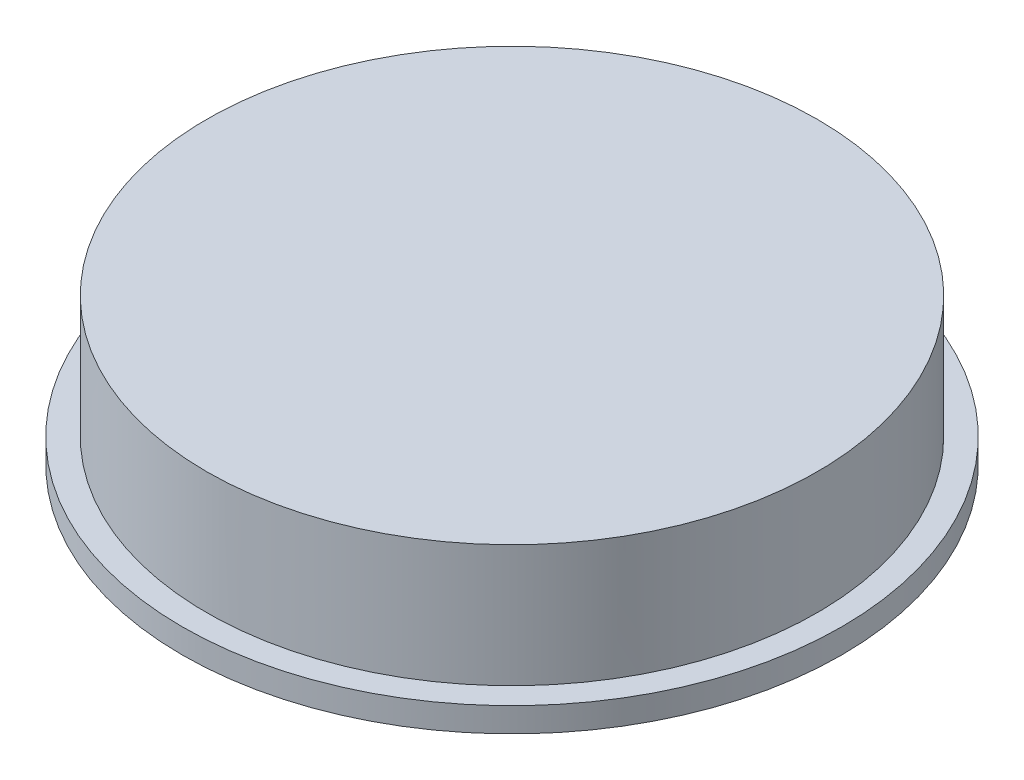
ISO-10303-21;
HEADER;
FILE_DESCRIPTION(('STEP AP214'),'2;1');
FILE_NAME('part.step','',(''),(''),'','','');
FILE_SCHEMA(('AUTOMOTIVE_DESIGN { 1 0 10303 214 1 1 1 1 }'));
ENDSEC;
DATA;
#1=APPLICATION_CONTEXT('core data for automotive mechanical design processes');
#2=APPLICATION_PROTOCOL_DEFINITION('international standard','automotive_design',2000,#1);
#3=PRODUCT_CONTEXT('',#1,'mechanical');
#4=PRODUCT('Part','Part','',(#3));
#5=PRODUCT_RELATED_PRODUCT_CATEGORY('part','',(#4));
#6=PRODUCT_DEFINITION_FORMATION('','',#4);
#7=PRODUCT_DEFINITION_CONTEXT('part definition',#1,'design');
#8=PRODUCT_DEFINITION('design','',#6,#7);
#9=PRODUCT_DEFINITION_SHAPE('','',#8);
#10=(LENGTH_UNIT() NAMED_UNIT(*) SI_UNIT(.MILLI.,.METRE.));
#11=(NAMED_UNIT(*) PLANE_ANGLE_UNIT() SI_UNIT($,.RADIAN.));
#12=(NAMED_UNIT(*) SI_UNIT($,.STERADIAN.) SOLID_ANGLE_UNIT());
#13=UNCERTAINTY_MEASURE_WITH_UNIT(LENGTH_MEASURE(1.E-05),#10,'distance_accuracy_value','');
#14=(GEOMETRIC_REPRESENTATION_CONTEXT(3) GLOBAL_UNCERTAINTY_ASSIGNED_CONTEXT((#13)) GLOBAL_UNIT_ASSIGNED_CONTEXT((#10,
#11,#12)) REPRESENTATION_CONTEXT('',''));
#15=CARTESIAN_POINT('',(0.,0.,0.));
#16=DIRECTION('',(0.,0.,1.));
#17=DIRECTION('',(1.,0.,0.));
#18=AXIS2_PLACEMENT_3D('',#15,#16,#17);
#19=CARTESIAN_POINT('',(0.,0.,0.));
#20=DIRECTION('',(0.,1.,0.));
#21=DIRECTION('',(0.,0.,1.));
#22=AXIS2_PLACEMENT_3D('',#19,#20,#21);
#23=PLANE('',#22);
#24=DIRECTION('',(-1.,0.,0.));
#25=VECTOR('',#24,1.);
#26=CARTESIAN_POINT('',(-3.8925,0.,-3.8925));
#27=LINE('',#26,#25);
#28=CARTESIAN_POINT('',(2.8925,0.,-3.8925));
#29=VERTEX_POINT('',#28);
#30=CARTESIAN_POINT('',(-2.8925,0.,-3.8925));
#31=VERTEX_POINT('',#30);
#32=EDGE_CURVE('E190',#29,#31,#27,.T.);
#33=ORIENTED_EDGE('',*,*,#32,.F.);
#34=CARTESIAN_POINT('',(2.8925,0.,-2.8925));
#35=DIRECTION('',(0.,1.,0.));
#36=DIRECTION('',(0.,0.,1.));
#37=AXIS2_PLACEMENT_3D('',#34,#35,#36);
#38=CIRCLE('',#37,1.);
#39=CARTESIAN_POINT('',(3.8925,0.,-2.8925));
#40=VERTEX_POINT('',#39);
#41=EDGE_CURVE('E219',#29,#40,#38,.F.);
#42=ORIENTED_EDGE('',*,*,#41,.T.);
#43=DIRECTION('',(0.,0.,-1.));
#44=VECTOR('',#43,1.);
#45=CARTESIAN_POINT('',(3.8925,0.,-3.8925));
#46=LINE('',#45,#44);
#47=CARTESIAN_POINT('',(3.8925,0.,2.8925));
#48=VERTEX_POINT('',#47);
#49=EDGE_CURVE('E165',#48,#40,#46,.T.);
#50=ORIENTED_EDGE('',*,*,#49,.F.);
#51=CARTESIAN_POINT('',(2.8925,0.,2.8925));
#52=DIRECTION('',(0.,1.,0.));
#53=DIRECTION('',(0.,0.,1.));
#54=AXIS2_PLACEMENT_3D('',#51,#52,#53);
#55=CIRCLE('',#54,1.);
#56=CARTESIAN_POINT('',(2.8925,0.,3.8925));
#57=VERTEX_POINT('',#56);
#58=EDGE_CURVE('E210',#48,#57,#55,.F.);
#59=ORIENTED_EDGE('',*,*,#58,.T.);
#60=DIRECTION('',(1.,0.,0.));
#61=VECTOR('',#60,1.);
#62=CARTESIAN_POINT('',(-3.8925,0.,3.8925));
#63=LINE('',#62,#61);
#64=CARTESIAN_POINT('',(-2.8925,0.,3.8925));
#65=VERTEX_POINT('',#64);
#66=EDGE_CURVE('E176',#65,#57,#63,.T.);
#67=ORIENTED_EDGE('',*,*,#66,.F.);
#68=CARTESIAN_POINT('',(-2.8925,0.,2.8925));
#69=DIRECTION('',(0.,1.,0.));
#70=DIRECTION('',(0.,0.,1.));
#71=AXIS2_PLACEMENT_3D('',#68,#69,#70);
#72=CIRCLE('',#71,1.);
#73=CARTESIAN_POINT('',(-3.8925,0.,2.8925));
#74=VERTEX_POINT('',#73);
#75=EDGE_CURVE('E213',#65,#74,#72,.F.);
#76=ORIENTED_EDGE('',*,*,#75,.T.);
#77=DIRECTION('',(0.,0.,1.));
#78=VECTOR('',#77,1.);
#79=CARTESIAN_POINT('',(-3.8925,0.,-3.8925));
#80=LINE('',#79,#78);
#81=CARTESIAN_POINT('',(-3.8925,0.,-2.8925));
#82=VERTEX_POINT('',#81);
#83=EDGE_CURVE('E194',#82,#74,#80,.T.);
#84=ORIENTED_EDGE('',*,*,#83,.F.);
#85=CARTESIAN_POINT('',(-2.8925,0.,-2.8925));
#86=DIRECTION('',(0.,1.,0.));
#87=DIRECTION('',(0.,0.,1.));
#88=AXIS2_PLACEMENT_3D('',#85,#86,#87);
#89=CIRCLE('',#88,1.);
#90=EDGE_CURVE('E216',#82,#31,#89,.F.);
#91=ORIENTED_EDGE('',*,*,#90,.T.);
#92=EDGE_LOOP('',(#33,#42,#50,#59,#67,#76,#84,#91));
#93=FACE_BOUND('',#92,.T.);
#94=DIRECTION('',(0.,0.,-1.));
#95=VECTOR('',#94,1.);
#96=CARTESIAN_POINT('',(1.8925,0.,-1.8925));
#97=LINE('',#96,#95);
#98=CARTESIAN_POINT('',(1.8925,0.,1.8925));
#99=VERTEX_POINT('',#98);
#100=CARTESIAN_POINT('',(1.8925,0.,-1.8925));
#101=VERTEX_POINT('',#100);
#102=EDGE_CURVE('E339',#99,#101,#97,.T.);
#103=ORIENTED_EDGE('',*,*,#102,.T.);
#104=DIRECTION('',(-1.,0.,0.));
#105=VECTOR('',#104,1.);
#106=CARTESIAN_POINT('',(-1.8925,0.,-1.8925));
#107=LINE('',#106,#105);
#108=CARTESIAN_POINT('',(-1.8925,0.,-1.8925));
#109=VERTEX_POINT('',#108);
#110=EDGE_CURVE('E343',#101,#109,#107,.T.);
#111=ORIENTED_EDGE('',*,*,#110,.T.);
#112=DIRECTION('',(0.,0.,1.));
#113=VECTOR('',#112,1.);
#114=CARTESIAN_POINT('',(-1.8925,0.,-1.8925));
#115=LINE('',#114,#113);
#116=CARTESIAN_POINT('',(-1.8925,0.,1.8925));
#117=VERTEX_POINT('',#116);
#118=EDGE_CURVE('E158',#109,#117,#115,.T.);
#119=ORIENTED_EDGE('',*,*,#118,.T.);
#120=DIRECTION('',(1.,0.,0.));
#121=VECTOR('',#120,1.);
#122=CARTESIAN_POINT('',(-1.8925,0.,1.8925));
#123=LINE('',#122,#121);
#124=EDGE_CURVE('E347',#117,#99,#123,.T.);
#125=ORIENTED_EDGE('',*,*,#124,.T.);
#126=EDGE_LOOP('',(#103,#111,#119,#125));
#127=FACE_BOUND('',#126,.T.);
#128=ADVANCED_FACE('F45',(#93,#127),#23,.F.);
#129=CARTESIAN_POINT('',(3.8925,4.,-3.8925));
#130=DIRECTION('',(-1.,0.,0.));
#131=DIRECTION('',(0.,0.,1.));
#132=AXIS2_PLACEMENT_3D('',#129,#130,#131);
#133=PLANE('',#132);
#134=ORIENTED_EDGE('',*,*,#49,.T.);
#135=DIRECTION('',(0.,-1.,0.));
#136=VECTOR('',#135,1.);
#137=CARTESIAN_POINT('',(3.8925,4.,-2.8925));
#138=LINE('',#137,#136);
#139=CARTESIAN_POINT('',(3.8925,4.,-2.8925));
#140=VERTEX_POINT('',#139);
#141=EDGE_CURVE('E226',#40,#140,#138,.F.);
#142=ORIENTED_EDGE('',*,*,#141,.T.);
#143=DIRECTION('',(0.,0.,-1.));
#144=VECTOR('',#143,1.);
#145=CARTESIAN_POINT('',(3.8925,4.,-3.8925));
#146=LINE('',#145,#144);
#147=CARTESIAN_POINT('',(3.8925,4.,2.8925));
#148=VERTEX_POINT('',#147);
#149=EDGE_CURVE('E171',#148,#140,#146,.T.);
#150=ORIENTED_EDGE('',*,*,#149,.F.);
#151=DIRECTION('',(0.,-1.,0.));
#152=VECTOR('',#151,1.);
#153=CARTESIAN_POINT('',(3.8925,4.,2.8925));
#154=LINE('',#153,#152);
#155=EDGE_CURVE('E222',#148,#48,#154,.T.);
#156=ORIENTED_EDGE('',*,*,#155,.T.);
#157=EDGE_LOOP('',(#134,#142,#150,#156));
#158=FACE_BOUND('',#157,.T.);
#159=ADVANCED_FACE('F273',(#158),#133,.F.);
#160=CARTESIAN_POINT('',(-3.8925,4.,-3.8925));
#161=DIRECTION('',(0.,0.,1.));
#162=DIRECTION('',(1.,0.,0.));
#163=AXIS2_PLACEMENT_3D('',#160,#161,#162);
#164=PLANE('',#163);
#165=DIRECTION('',(-1.,0.,0.));
#166=VECTOR('',#165,1.);
#167=CARTESIAN_POINT('',(-3.8925,4.,-3.8925));
#168=LINE('',#167,#166);
#169=CARTESIAN_POINT('',(2.8925,4.,-3.8925));
#170=VERTEX_POINT('',#169);
#171=CARTESIAN_POINT('',(-2.8925,4.,-3.8925));
#172=VERTEX_POINT('',#171);
#173=EDGE_CURVE('E175',#170,#172,#168,.T.);
#174=ORIENTED_EDGE('',*,*,#173,.F.);
#175=DIRECTION('',(0.,-1.,0.));
#176=VECTOR('',#175,1.);
#177=CARTESIAN_POINT('',(2.8925,4.,-3.8925));
#178=LINE('',#177,#176);
#179=EDGE_CURVE('E206',#170,#29,#178,.T.);
#180=ORIENTED_EDGE('',*,*,#179,.T.);
#181=ORIENTED_EDGE('',*,*,#32,.T.);
#182=DIRECTION('',(0.,-1.,0.));
#183=VECTOR('',#182,1.);
#184=CARTESIAN_POINT('',(-2.8925,4.,-3.8925));
#185=LINE('',#184,#183);
#186=EDGE_CURVE('E203',#31,#172,#185,.F.);
#187=ORIENTED_EDGE('',*,*,#186,.T.);
#188=EDGE_LOOP('',(#174,#180,#181,#187));
#189=FACE_BOUND('',#188,.T.);
#190=ADVANCED_FACE('F265',(#189),#164,.F.);
#191=CARTESIAN_POINT('',(-3.8925,4.,-3.8925));
#192=DIRECTION('',(1.,0.,0.));
#193=DIRECTION('',(0.,0.,-1.));
#194=AXIS2_PLACEMENT_3D('',#191,#192,#193);
#195=PLANE('',#194);
#196=DIRECTION('',(0.,0.,1.));
#197=VECTOR('',#196,1.);
#198=CARTESIAN_POINT('',(-3.8925,4.,-3.8925));
#199=LINE('',#198,#197);
#200=CARTESIAN_POINT('',(-3.8925,4.,-2.8925));
#201=VERTEX_POINT('',#200);
#202=CARTESIAN_POINT('',(-3.8925,4.,2.8925));
#203=VERTEX_POINT('',#202);
#204=EDGE_CURVE('E180',#201,#203,#199,.T.);
#205=ORIENTED_EDGE('',*,*,#204,.F.);
#206=DIRECTION('',(0.,-1.,0.));
#207=VECTOR('',#206,1.);
#208=CARTESIAN_POINT('',(-3.8925,4.,-2.8925));
#209=LINE('',#208,#207);
#210=EDGE_CURVE('E232',#201,#82,#209,.T.);
#211=ORIENTED_EDGE('',*,*,#210,.T.);
#212=ORIENTED_EDGE('',*,*,#83,.T.);
#213=DIRECTION('',(0.,-1.,0.));
#214=VECTOR('',#213,1.);
#215=CARTESIAN_POINT('',(-3.8925,4.,2.8925));
#216=LINE('',#215,#214);
#217=EDGE_CURVE('E229',#74,#203,#216,.F.);
#218=ORIENTED_EDGE('',*,*,#217,.T.);
#219=EDGE_LOOP('',(#205,#211,#212,#218));
#220=FACE_BOUND('',#219,.T.);
#221=ADVANCED_FACE('F257',(#220),#195,.F.);
#222=CARTESIAN_POINT('',(-3.8925,4.,3.8925));
#223=DIRECTION('',(0.,0.,-1.));
#224=DIRECTION('',(-1.,0.,0.));
#225=AXIS2_PLACEMENT_3D('',#222,#223,#224);
#226=PLANE('',#225);
#227=DIRECTION('',(1.,0.,0.));
#228=VECTOR('',#227,1.);
#229=CARTESIAN_POINT('',(-3.8925,4.,3.8925));
#230=LINE('',#229,#228);
#231=CARTESIAN_POINT('',(-2.8925,4.,3.8925));
#232=VERTEX_POINT('',#231);
#233=CARTESIAN_POINT('',(2.8925,4.,3.8925));
#234=VERTEX_POINT('',#233);
#235=EDGE_CURVE('E183',#232,#234,#230,.T.);
#236=ORIENTED_EDGE('',*,*,#235,.F.);
#237=DIRECTION('',(0.,-1.,0.));
#238=VECTOR('',#237,1.);
#239=CARTESIAN_POINT('',(-2.8925,4.,3.8925));
#240=LINE('',#239,#238);
#241=EDGE_CURVE('E238',#232,#65,#240,.T.);
#242=ORIENTED_EDGE('',*,*,#241,.T.);
#243=ORIENTED_EDGE('',*,*,#66,.T.);
#244=DIRECTION('',(0.,-1.,0.));
#245=VECTOR('',#244,1.);
#246=CARTESIAN_POINT('',(2.8925,4.,3.8925));
#247=LINE('',#246,#245);
#248=EDGE_CURVE('E61',#57,#234,#247,.F.);
#249=ORIENTED_EDGE('',*,*,#248,.T.);
#250=EDGE_LOOP('',(#236,#242,#243,#249));
#251=FACE_BOUND('',#250,.T.);
#252=ADVANCED_FACE('F279',(#251),#226,.F.);
#253=CARTESIAN_POINT('',(1.8925,4.,-1.8925));
#254=DIRECTION('',(-1.,0.,0.));
#255=DIRECTION('',(0.,0.,1.));
#256=AXIS2_PLACEMENT_3D('',#253,#254,#255);
#257=PLANE('',#256);
#258=ORIENTED_EDGE('',*,*,#102,.F.);
#259=DIRECTION('',(0.,-1.,0.));
#260=VECTOR('',#259,1.);
#261=CARTESIAN_POINT('',(1.8925,4.,1.8925));
#262=LINE('',#261,#260);
#263=CARTESIAN_POINT('',(1.8925,4.,1.8925));
#264=VERTEX_POINT('',#263);
#265=EDGE_CURVE('E167',#264,#99,#262,.T.);
#266=ORIENTED_EDGE('',*,*,#265,.F.);
#267=DIRECTION('',(0.,0.,-1.));
#268=VECTOR('',#267,1.);
#269=CARTESIAN_POINT('',(1.8925,4.,-1.8925));
#270=LINE('',#269,#268);
#271=CARTESIAN_POINT('',(1.8925,4.,-1.8925));
#272=VERTEX_POINT('',#271);
#273=EDGE_CURVE('E154',#264,#272,#270,.T.);
#274=ORIENTED_EDGE('',*,*,#273,.T.);
#275=DIRECTION('',(0.,-1.,0.));
#276=VECTOR('',#275,1.);
#277=CARTESIAN_POINT('',(1.8925,4.,-1.8925));
#278=LINE('',#277,#276);
#279=EDGE_CURVE('E152',#272,#101,#278,.T.);
#280=ORIENTED_EDGE('',*,*,#279,.T.);
#281=EDGE_LOOP('',(#258,#266,#274,#280));
#282=FACE_BOUND('',#281,.T.);
#283=ADVANCED_FACE('F298',(#282),#257,.T.);
#284=CARTESIAN_POINT('',(-1.8925,4.,-1.8925));
#285=DIRECTION('',(0.,0.,1.));
#286=DIRECTION('',(1.,0.,0.));
#287=AXIS2_PLACEMENT_3D('',#284,#285,#286);
#288=PLANE('',#287);
#289=ORIENTED_EDGE('',*,*,#110,.F.);
#290=ORIENTED_EDGE('',*,*,#279,.F.);
#291=DIRECTION('',(-1.,0.,0.));
#292=VECTOR('',#291,1.);
#293=CARTESIAN_POINT('',(-1.8925,4.,-1.8925));
#294=LINE('',#293,#292);
#295=CARTESIAN_POINT('',(-1.8925,4.,-1.8925));
#296=VERTEX_POINT('',#295);
#297=EDGE_CURVE('E137',#272,#296,#294,.T.);
#298=ORIENTED_EDGE('',*,*,#297,.T.);
#299=DIRECTION('',(0.,-1.,0.));
#300=VECTOR('',#299,1.);
#301=CARTESIAN_POINT('',(-1.8925,4.,-1.8925));
#302=LINE('',#301,#300);
#303=EDGE_CURVE('E149',#296,#109,#302,.T.);
#304=ORIENTED_EDGE('',*,*,#303,.T.);
#305=EDGE_LOOP('',(#289,#290,#298,#304));
#306=FACE_BOUND('',#305,.T.);
#307=ADVANCED_FACE('F148',(#306),#288,.T.);
#308=CARTESIAN_POINT('',(-1.8925,4.,-1.8925));
#309=DIRECTION('',(1.,0.,0.));
#310=DIRECTION('',(0.,0.,-1.));
#311=AXIS2_PLACEMENT_3D('',#308,#309,#310);
#312=PLANE('',#311);
#313=ORIENTED_EDGE('',*,*,#118,.F.);
#314=ORIENTED_EDGE('',*,*,#303,.F.);
#315=DIRECTION('',(0.,0.,1.));
#316=VECTOR('',#315,1.);
#317=CARTESIAN_POINT('',(-1.8925,4.,-1.8925));
#318=LINE('',#317,#316);
#319=CARTESIAN_POINT('',(-1.8925,4.,1.8925));
#320=VERTEX_POINT('',#319);
#321=EDGE_CURVE('E134',#296,#320,#318,.T.);
#322=ORIENTED_EDGE('',*,*,#321,.T.);
#323=DIRECTION('',(0.,-1.,0.));
#324=VECTOR('',#323,1.);
#325=CARTESIAN_POINT('',(-1.8925,4.,1.8925));
#326=LINE('',#325,#324);
#327=EDGE_CURVE('E161',#320,#117,#326,.T.);
#328=ORIENTED_EDGE('',*,*,#327,.T.);
#329=EDGE_LOOP('',(#313,#314,#322,#328));
#330=FACE_BOUND('',#329,.T.);
#331=ADVANCED_FACE('F156',(#330),#312,.T.);
#332=CARTESIAN_POINT('',(-1.8925,4.,1.8925));
#333=DIRECTION('',(0.,0.,-1.));
#334=DIRECTION('',(-1.,0.,0.));
#335=AXIS2_PLACEMENT_3D('',#332,#333,#334);
#336=PLANE('',#335);
#337=ORIENTED_EDGE('',*,*,#124,.F.);
#338=ORIENTED_EDGE('',*,*,#327,.F.);
#339=DIRECTION('',(1.,0.,0.));
#340=VECTOR('',#339,1.);
#341=CARTESIAN_POINT('',(-1.8925,4.,1.8925));
#342=LINE('',#341,#340);
#343=EDGE_CURVE('E140',#320,#264,#342,.T.);
#344=ORIENTED_EDGE('',*,*,#343,.T.);
#345=ORIENTED_EDGE('',*,*,#265,.T.);
#346=EDGE_LOOP('',(#337,#338,#344,#345));
#347=FACE_BOUND('',#346,.T.);
#348=ADVANCED_FACE('F325',(#347),#336,.T.);
#349=CARTESIAN_POINT('',(0.,4.,0.));
#350=DIRECTION('',(0.,1.,0.));
#351=DIRECTION('',(0.,0.,1.));
#352=AXIS2_PLACEMENT_3D('',#349,#350,#351);
#353=PLANE('',#352);
#354=ORIENTED_EDGE('',*,*,#297,.F.);
#355=ORIENTED_EDGE('',*,*,#273,.F.);
#356=ORIENTED_EDGE('',*,*,#343,.F.);
#357=ORIENTED_EDGE('',*,*,#321,.F.);
#358=EDGE_LOOP('',(#354,#355,#356,#357));
#359=FACE_BOUND('',#358,.T.);
#360=ADVANCED_FACE('F136',(#359),#353,.F.);
#361=ORIENTED_EDGE('',*,*,#204,.T.);
#362=CARTESIAN_POINT('',(-2.8925,4.,2.8925));
#363=DIRECTION('',(0.,1.,0.));
#364=DIRECTION('',(0.,0.,1.));
#365=AXIS2_PLACEMENT_3D('',#362,#363,#364);
#366=CIRCLE('',#365,1.);
#367=EDGE_CURVE('E54',#203,#232,#366,.T.);
#368=ORIENTED_EDGE('',*,*,#367,.T.);
#369=ORIENTED_EDGE('',*,*,#235,.T.);
#370=CARTESIAN_POINT('',(2.8925,4.,2.8925));
#371=DIRECTION('',(0.,1.,0.));
#372=DIRECTION('',(0.,0.,1.));
#373=AXIS2_PLACEMENT_3D('',#370,#371,#372);
#374=CIRCLE('',#373,1.);
#375=EDGE_CURVE('E11',#234,#148,#374,.T.);
#376=ORIENTED_EDGE('',*,*,#375,.T.);
#377=ORIENTED_EDGE('',*,*,#149,.T.);
#378=CARTESIAN_POINT('',(2.8925,4.,-2.8925));
#379=DIRECTION('',(0.,1.,0.));
#380=DIRECTION('',(0.,0.,1.));
#381=AXIS2_PLACEMENT_3D('',#378,#379,#380);
#382=CIRCLE('',#381,1.);
#383=EDGE_CURVE('E242',#140,#170,#382,.T.);
#384=ORIENTED_EDGE('',*,*,#383,.T.);
#385=ORIENTED_EDGE('',*,*,#173,.T.);
#386=CARTESIAN_POINT('',(-2.8925,4.,-2.8925));
#387=DIRECTION('',(0.,1.,0.));
#388=DIRECTION('',(0.,0.,1.));
#389=AXIS2_PLACEMENT_3D('',#386,#387,#388);
#390=CIRCLE('',#389,1.);
#391=EDGE_CURVE('E245',#172,#201,#390,.T.);
#392=ORIENTED_EDGE('',*,*,#391,.T.);
#393=EDGE_LOOP('',(#361,#368,#369,#376,#377,#384,#385,#392));
#394=FACE_BOUND('',#393,.T.);
#395=CARTESIAN_POINT('',(0.,4.,0.));
#396=DIRECTION('',(0.,-1.,0.));
#397=DIRECTION('',(0.,0.,-1.));
#398=AXIS2_PLACEMENT_3D('',#395,#396,#397);
#399=CIRCLE('',#398,13.5);
#400=CARTESIAN_POINT('',(0.,4.,-13.5));
#401=VERTEX_POINT('',#400);
#402=EDGE_CURVE('E364',#401,#401,#399,.T.);
#403=ORIENTED_EDGE('',*,*,#402,.T.);
#404=EDGE_LOOP('',(#403));
#405=FACE_BOUND('',#404,.T.);
#406=ADVANCED_FACE('F250',(#394,#405),#353,.F.);
#407=CARTESIAN_POINT('',(0.,5.,0.));
#408=DIRECTION('',(0.,-1.,0.));
#409=DIRECTION('',(0.,0.,-1.));
#410=AXIS2_PLACEMENT_3D('',#407,#408,#409);
#411=CYLINDRICAL_SURFACE('',#410,13.5);
#412=CARTESIAN_POINT('',(0.,5.,0.));
#413=DIRECTION('',(0.,-1.,0.));
#414=DIRECTION('',(0.,0.,-1.));
#415=AXIS2_PLACEMENT_3D('',#412,#413,#414);
#416=CIRCLE('',#415,13.5);
#417=CARTESIAN_POINT('',(0.,5.,-13.5));
#418=VERTEX_POINT('',#417);
#419=EDGE_CURVE('E363',#418,#418,#416,.T.);
#420=ORIENTED_EDGE('',*,*,#419,.T.);
#421=EDGE_LOOP('',(#420));
#422=FACE_BOUND('',#421,.T.);
#423=ORIENTED_EDGE('',*,*,#402,.F.);
#424=EDGE_LOOP('',(#423));
#425=FACE_BOUND('',#424,.T.);
#426=ADVANCED_FACE('F372',(#422,#425),#411,.T.);
#427=CARTESIAN_POINT('',(0.,5.,0.));
#428=DIRECTION('',(0.,-1.,0.));
#429=DIRECTION('',(0.,0.,-1.));
#430=AXIS2_PLACEMENT_3D('',#427,#428,#429);
#431=PLANE('',#430);
#432=CARTESIAN_POINT('',(0.,5.,0.));
#433=DIRECTION('',(0.,-1.,0.));
#434=DIRECTION('',(0.,0.,-1.));
#435=AXIS2_PLACEMENT_3D('',#432,#433,#434);
#436=CIRCLE('',#435,12.5);
#437=CARTESIAN_POINT('',(0.,5.,-12.5));
#438=VERTEX_POINT('',#437);
#439=EDGE_CURVE('E186',#438,#438,#436,.T.);
#440=ORIENTED_EDGE('',*,*,#439,.T.);
#441=EDGE_LOOP('',(#440));
#442=FACE_BOUND('',#441,.T.);
#443=ORIENTED_EDGE('',*,*,#419,.F.);
#444=EDGE_LOOP('',(#443));
#445=FACE_BOUND('',#444,.T.);
#446=ADVANCED_FACE('F318',(#442,#445),#431,.F.);
#447=CARTESIAN_POINT('',(0.,10.,0.));
#448=DIRECTION('',(0.,1.,0.));
#449=DIRECTION('',(0.,0.,1.));
#450=AXIS2_PLACEMENT_3D('',#447,#448,#449);
#451=PLANE('',#450);
#452=CARTESIAN_POINT('',(0.,10.,0.));
#453=DIRECTION('',(0.,1.,0.));
#454=DIRECTION('',(0.,0.,1.));
#455=AXIS2_PLACEMENT_3D('',#452,#453,#454);
#456=CIRCLE('',#455,12.5);
#457=CARTESIAN_POINT('',(0.,10.,12.5));
#458=VERTEX_POINT('',#457);
#459=EDGE_CURVE('E344',#458,#458,#456,.T.);
#460=ORIENTED_EDGE('',*,*,#459,.T.);
#461=EDGE_LOOP('',(#460));
#462=FACE_BOUND('',#461,.T.);
#463=ADVANCED_FACE('F311',(#462),#451,.T.);
#464=CARTESIAN_POINT('',(0.,10.,0.));
#465=DIRECTION('',(0.,-1.,0.));
#466=DIRECTION('',(0.,0.,-1.));
#467=AXIS2_PLACEMENT_3D('',#464,#465,#466);
#468=CYLINDRICAL_SURFACE('',#467,12.5);
#469=ORIENTED_EDGE('',*,*,#459,.F.);
#470=EDGE_LOOP('',(#469));
#471=FACE_BOUND('',#470,.T.);
#472=ORIENTED_EDGE('',*,*,#439,.F.);
#473=EDGE_LOOP('',(#472));
#474=FACE_BOUND('',#473,.T.);
#475=ADVANCED_FACE('F307',(#471,#474),#468,.T.);
#476=CARTESIAN_POINT('',(2.8925,4.,-2.8925));
#477=DIRECTION('',(0.,-1.,0.));
#478=DIRECTION('',(0.,0.,-1.));
#479=AXIS2_PLACEMENT_3D('',#476,#477,#478);
#480=CYLINDRICAL_SURFACE('',#479,1.);
#481=ORIENTED_EDGE('',*,*,#383,.F.);
#482=ORIENTED_EDGE('',*,*,#141,.F.);
#483=ORIENTED_EDGE('',*,*,#41,.F.);
#484=ORIENTED_EDGE('',*,*,#179,.F.);
#485=EDGE_LOOP('',(#481,#482,#483,#484));
#486=FACE_BOUND('',#485,.T.);
#487=ADVANCED_FACE('F269',(#486),#480,.T.);
#488=CARTESIAN_POINT('',(-2.8925,4.,-2.8925));
#489=DIRECTION('',(0.,-1.,0.));
#490=DIRECTION('',(0.,0.,-1.));
#491=AXIS2_PLACEMENT_3D('',#488,#489,#490);
#492=CYLINDRICAL_SURFACE('',#491,1.);
#493=ORIENTED_EDGE('',*,*,#391,.F.);
#494=ORIENTED_EDGE('',*,*,#186,.F.);
#495=ORIENTED_EDGE('',*,*,#90,.F.);
#496=ORIENTED_EDGE('',*,*,#210,.F.);
#497=EDGE_LOOP('',(#493,#494,#495,#496));
#498=FACE_BOUND('',#497,.T.);
#499=ADVANCED_FACE('F260',(#498),#492,.T.);
#500=CARTESIAN_POINT('',(-2.8925,4.,2.8925));
#501=DIRECTION('',(0.,-1.,0.));
#502=DIRECTION('',(0.,0.,-1.));
#503=AXIS2_PLACEMENT_3D('',#500,#501,#502);
#504=CYLINDRICAL_SURFACE('',#503,1.);
#505=ORIENTED_EDGE('',*,*,#367,.F.);
#506=ORIENTED_EDGE('',*,*,#217,.F.);
#507=ORIENTED_EDGE('',*,*,#75,.F.);
#508=ORIENTED_EDGE('',*,*,#241,.F.);
#509=EDGE_LOOP('',(#505,#506,#507,#508));
#510=FACE_BOUND('',#509,.T.);
#511=ADVANCED_FACE('F282',(#510),#504,.T.);
#512=CARTESIAN_POINT('',(2.8925,4.,2.8925));
#513=DIRECTION('',(0.,-1.,0.));
#514=DIRECTION('',(0.,0.,-1.));
#515=AXIS2_PLACEMENT_3D('',#512,#513,#514);
#516=CYLINDRICAL_SURFACE('',#515,1.);
#517=ORIENTED_EDGE('',*,*,#375,.F.);
#518=ORIENTED_EDGE('',*,*,#248,.F.);
#519=ORIENTED_EDGE('',*,*,#58,.F.);
#520=ORIENTED_EDGE('',*,*,#155,.F.);
#521=EDGE_LOOP('',(#517,#518,#519,#520));
#522=FACE_BOUND('',#521,.T.);
#523=ADVANCED_FACE('F47',(#522),#516,.T.);
#524=CLOSED_SHELL('',(#128,#159,#190,#221,#252,#283,#307,#331,#348,#360,#406,#426,#446,#463,
#475,#487,#499,#511,#523));
#525=MANIFOLD_SOLID_BREP('B2',#524);
#526=ADVANCED_BREP_SHAPE_REPRESENTATION('',(#18,#525),#14);
#527=SHAPE_DEFINITION_REPRESENTATION(#9,#526);
ENDSEC;
END-ISO-10303-21;
